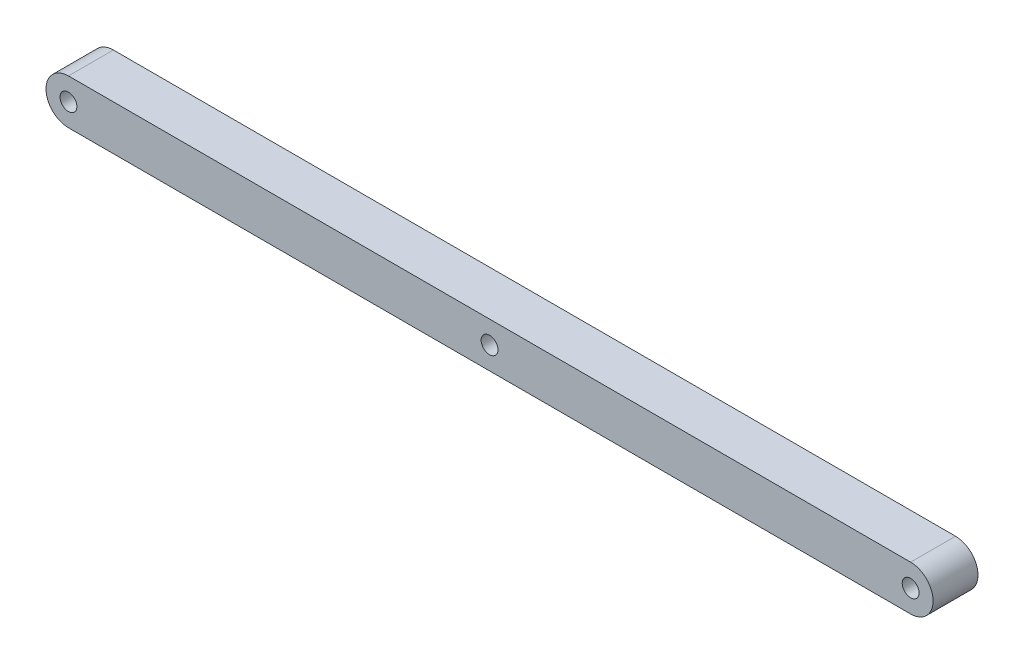
ISO-10303-21;
HEADER;
FILE_DESCRIPTION(('STEP AP214'),'2;1');
FILE_NAME('part.step','',(''),(''),'','','');
FILE_SCHEMA(('AUTOMOTIVE_DESIGN { 1 0 10303 214 1 1 1 1 }'));
ENDSEC;
DATA;
#1=APPLICATION_CONTEXT('core data for automotive mechanical design processes');
#2=APPLICATION_PROTOCOL_DEFINITION('international standard','automotive_design',2000,#1);
#3=PRODUCT_CONTEXT('',#1,'mechanical');
#4=PRODUCT('Part','Part','',(#3));
#5=PRODUCT_RELATED_PRODUCT_CATEGORY('part','',(#4));
#6=PRODUCT_DEFINITION_FORMATION('','',#4);
#7=PRODUCT_DEFINITION_CONTEXT('part definition',#1,'design');
#8=PRODUCT_DEFINITION('design','',#6,#7);
#9=PRODUCT_DEFINITION_SHAPE('','',#8);
#10=(LENGTH_UNIT() NAMED_UNIT(*) SI_UNIT(.MILLI.,.METRE.));
#11=(NAMED_UNIT(*) PLANE_ANGLE_UNIT() SI_UNIT($,.RADIAN.));
#12=(NAMED_UNIT(*) SI_UNIT($,.STERADIAN.) SOLID_ANGLE_UNIT());
#13=UNCERTAINTY_MEASURE_WITH_UNIT(LENGTH_MEASURE(1.E-05),#10,'distance_accuracy_value','');
#14=(GEOMETRIC_REPRESENTATION_CONTEXT(3) GLOBAL_UNCERTAINTY_ASSIGNED_CONTEXT((#13)) GLOBAL_UNIT_ASSIGNED_CONTEXT((#10,
#11,#12)) REPRESENTATION_CONTEXT('',''));
#15=CARTESIAN_POINT('',(0.,0.,0.));
#16=DIRECTION('',(0.,0.,1.));
#17=DIRECTION('',(1.,0.,0.));
#18=AXIS2_PLACEMENT_3D('',#15,#16,#17);
#19=CARTESIAN_POINT('',(75.,0.,8.));
#20=DIRECTION('',(0.,0.,1.));
#21=DIRECTION('',(1.,0.,0.));
#22=AXIS2_PLACEMENT_3D('',#19,#20,#21);
#23=PLANE('',#22);
#24=CARTESIAN_POINT('',(0.,0.,8.));
#25=DIRECTION('',(0.,0.,1.));
#26=DIRECTION('',(1.,0.,0.));
#27=AXIS2_PLACEMENT_3D('',#24,#25,#26);
#28=CIRCLE('',#27,1.5);
#29=CARTESIAN_POINT('',(1.5,0.,8.));
#30=VERTEX_POINT('',#29);
#31=EDGE_CURVE('E146',#30,#30,#28,.T.);
#32=ORIENTED_EDGE('',*,*,#31,.F.);
#33=EDGE_LOOP('',(#32));
#34=FACE_BOUND('',#33,.T.);
#35=CARTESIAN_POINT('',(-75.,0.,8.));
#36=DIRECTION('',(0.,0.,1.));
#37=DIRECTION('',(1.,0.,0.));
#38=AXIS2_PLACEMENT_3D('',#35,#36,#37);
#39=CIRCLE('',#38,1.5);
#40=CARTESIAN_POINT('',(-73.5,0.,8.));
#41=VERTEX_POINT('',#40);
#42=EDGE_CURVE('E113',#41,#41,#39,.T.);
#43=ORIENTED_EDGE('',*,*,#42,.F.);
#44=EDGE_LOOP('',(#43));
#45=FACE_BOUND('',#44,.T.);
#46=CARTESIAN_POINT('',(75.,0.,8.));
#47=DIRECTION('',(0.,0.,1.));
#48=DIRECTION('',(1.,0.,0.));
#49=AXIS2_PLACEMENT_3D('',#46,#47,#48);
#50=CIRCLE('',#49,4.);
#51=CARTESIAN_POINT('',(75.,-4.,8.));
#52=VERTEX_POINT('',#51);
#53=CARTESIAN_POINT('',(75.,4.,8.));
#54=VERTEX_POINT('',#53);
#55=EDGE_CURVE('E92',#52,#54,#50,.T.);
#56=ORIENTED_EDGE('',*,*,#55,.T.);
#57=DIRECTION('',(-1.,0.,0.));
#58=VECTOR('',#57,1.);
#59=CARTESIAN_POINT('',(75.,4.,8.));
#60=LINE('',#59,#58);
#61=CARTESIAN_POINT('',(-75.,3.99999999999998,8.));
#62=VERTEX_POINT('',#61);
#63=EDGE_CURVE('E87',#54,#62,#60,.T.);
#64=ORIENTED_EDGE('',*,*,#63,.T.);
#65=CARTESIAN_POINT('',(-75.,0.,8.));
#66=DIRECTION('',(0.,0.,1.));
#67=DIRECTION('',(1.,0.,0.));
#68=AXIS2_PLACEMENT_3D('',#65,#66,#67);
#69=CIRCLE('',#68,4.);
#70=CARTESIAN_POINT('',(-75.,-4.00000000000002,8.));
#71=VERTEX_POINT('',#70);
#72=EDGE_CURVE('E90',#62,#71,#69,.T.);
#73=ORIENTED_EDGE('',*,*,#72,.T.);
#74=DIRECTION('',(1.,0.,0.));
#75=VECTOR('',#74,1.);
#76=CARTESIAN_POINT('',(75.,-4.,8.));
#77=LINE('',#76,#75);
#78=EDGE_CURVE('E57',#71,#52,#77,.T.);
#79=ORIENTED_EDGE('',*,*,#78,.T.);
#80=EDGE_LOOP('',(#56,#64,#73,#79));
#81=FACE_BOUND('',#80,.T.);
#82=CARTESIAN_POINT('',(75.,0.,8.));
#83=DIRECTION('',(0.,0.,1.));
#84=DIRECTION('',(1.,0.,0.));
#85=AXIS2_PLACEMENT_3D('',#82,#83,#84);
#86=CIRCLE('',#85,1.5);
#87=CARTESIAN_POINT('',(76.5,0.,8.));
#88=VERTEX_POINT('',#87);
#89=EDGE_CURVE('E135',#88,#88,#86,.T.);
#90=ORIENTED_EDGE('',*,*,#89,.F.);
#91=EDGE_LOOP('',(#90));
#92=FACE_BOUND('',#91,.T.);
#93=ADVANCED_FACE('F38',(#34,#45,#81,#92),#23,.T.);
#94=CARTESIAN_POINT('',(75.,0.,0.));
#95=DIRECTION('',(0.,0.,1.));
#96=DIRECTION('',(1.,0.,0.));
#97=AXIS2_PLACEMENT_3D('',#94,#95,#96);
#98=PLANE('',#97);
#99=CARTESIAN_POINT('',(0.,0.,0.));
#100=DIRECTION('',(0.,0.,1.));
#101=DIRECTION('',(1.,0.,0.));
#102=AXIS2_PLACEMENT_3D('',#99,#100,#101);
#103=CIRCLE('',#102,1.5);
#104=CARTESIAN_POINT('',(1.5,0.,0.));
#105=VERTEX_POINT('',#104);
#106=EDGE_CURVE('E42',#105,#105,#103,.T.);
#107=ORIENTED_EDGE('',*,*,#106,.T.);
#108=EDGE_LOOP('',(#107));
#109=FACE_BOUND('',#108,.T.);
#110=CARTESIAN_POINT('',(75.,0.,0.));
#111=DIRECTION('',(0.,0.,1.));
#112=DIRECTION('',(1.,0.,0.));
#113=AXIS2_PLACEMENT_3D('',#110,#111,#112);
#114=CIRCLE('',#113,4.);
#115=CARTESIAN_POINT('',(75.,-4.,0.));
#116=VERTEX_POINT('',#115);
#117=CARTESIAN_POINT('',(75.,4.,0.));
#118=VERTEX_POINT('',#117);
#119=EDGE_CURVE('E109',#116,#118,#114,.T.);
#120=ORIENTED_EDGE('',*,*,#119,.F.);
#121=DIRECTION('',(1.,0.,0.));
#122=VECTOR('',#121,1.);
#123=CARTESIAN_POINT('',(75.,-4.,0.));
#124=LINE('',#123,#122);
#125=CARTESIAN_POINT('',(-75.,-4.00000000000002,0.));
#126=VERTEX_POINT('',#125);
#127=EDGE_CURVE('E80',#126,#116,#124,.T.);
#128=ORIENTED_EDGE('',*,*,#127,.F.);
#129=CARTESIAN_POINT('',(-75.,0.,0.));
#130=DIRECTION('',(0.,0.,1.));
#131=DIRECTION('',(1.,0.,0.));
#132=AXIS2_PLACEMENT_3D('',#129,#130,#131);
#133=CIRCLE('',#132,4.);
#134=CARTESIAN_POINT('',(-75.,3.99999999999998,0.));
#135=VERTEX_POINT('',#134);
#136=EDGE_CURVE('E74',#135,#126,#133,.T.);
#137=ORIENTED_EDGE('',*,*,#136,.F.);
#138=DIRECTION('',(-1.,0.,0.));
#139=VECTOR('',#138,1.);
#140=CARTESIAN_POINT('',(75.,4.,0.));
#141=LINE('',#140,#139);
#142=EDGE_CURVE('E97',#118,#135,#141,.T.);
#143=ORIENTED_EDGE('',*,*,#142,.F.);
#144=EDGE_LOOP('',(#120,#128,#137,#143));
#145=FACE_BOUND('',#144,.T.);
#146=CARTESIAN_POINT('',(-75.,0.,0.));
#147=DIRECTION('',(0.,0.,1.));
#148=DIRECTION('',(1.,0.,0.));
#149=AXIS2_PLACEMENT_3D('',#146,#147,#148);
#150=CIRCLE('',#149,1.5);
#151=CARTESIAN_POINT('',(-73.5,0.,0.));
#152=VERTEX_POINT('',#151);
#153=EDGE_CURVE('E131',#152,#152,#150,.T.);
#154=ORIENTED_EDGE('',*,*,#153,.T.);
#155=EDGE_LOOP('',(#154));
#156=FACE_BOUND('',#155,.T.);
#157=CARTESIAN_POINT('',(75.,0.,0.));
#158=DIRECTION('',(0.,0.,1.));
#159=DIRECTION('',(1.,0.,0.));
#160=AXIS2_PLACEMENT_3D('',#157,#158,#159);
#161=CIRCLE('',#160,1.5);
#162=CARTESIAN_POINT('',(76.5,0.,0.));
#163=VERTEX_POINT('',#162);
#164=EDGE_CURVE('E139',#163,#163,#161,.T.);
#165=ORIENTED_EDGE('',*,*,#164,.T.);
#166=EDGE_LOOP('',(#165));
#167=FACE_BOUND('',#166,.T.);
#168=ADVANCED_FACE('F126',(#109,#145,#156,#167),#98,.F.);
#169=CARTESIAN_POINT('',(75.,0.,8.));
#170=DIRECTION('',(0.,0.,-1.));
#171=DIRECTION('',(-1.,0.,0.));
#172=AXIS2_PLACEMENT_3D('',#169,#170,#171);
#173=CYLINDRICAL_SURFACE('',#172,4.);
#174=ORIENTED_EDGE('',*,*,#119,.T.);
#175=DIRECTION('',(0.,0.,-1.));
#176=VECTOR('',#175,1.);
#177=CARTESIAN_POINT('',(75.,4.,8.));
#178=LINE('',#177,#176);
#179=EDGE_CURVE('E11',#54,#118,#178,.T.);
#180=ORIENTED_EDGE('',*,*,#179,.F.);
#181=ORIENTED_EDGE('',*,*,#55,.F.);
#182=DIRECTION('',(0.,0.,-1.));
#183=VECTOR('',#182,1.);
#184=CARTESIAN_POINT('',(75.,-4.,8.));
#185=LINE('',#184,#183);
#186=EDGE_CURVE('E105',#52,#116,#185,.T.);
#187=ORIENTED_EDGE('',*,*,#186,.T.);
#188=EDGE_LOOP('',(#174,#180,#181,#187));
#189=FACE_BOUND('',#188,.T.);
#190=ADVANCED_FACE('F40',(#189),#173,.T.);
#191=CARTESIAN_POINT('',(75.,4.,8.));
#192=DIRECTION('',(0.,-1.,0.));
#193=DIRECTION('',(1.,0.,0.));
#194=AXIS2_PLACEMENT_3D('',#191,#192,#193);
#195=PLANE('',#194);
#196=ORIENTED_EDGE('',*,*,#142,.T.);
#197=DIRECTION('',(0.,0.,-1.));
#198=VECTOR('',#197,1.);
#199=CARTESIAN_POINT('',(-75.,3.99999999999998,8.));
#200=LINE('',#199,#198);
#201=EDGE_CURVE('E49',#62,#135,#200,.T.);
#202=ORIENTED_EDGE('',*,*,#201,.F.);
#203=ORIENTED_EDGE('',*,*,#63,.F.);
#204=ORIENTED_EDGE('',*,*,#179,.T.);
#205=EDGE_LOOP('',(#196,#202,#203,#204));
#206=FACE_BOUND('',#205,.T.);
#207=ADVANCED_FACE('F96',(#206),#195,.F.);
#208=CARTESIAN_POINT('',(-75.,0.,8.));
#209=DIRECTION('',(0.,0.,-1.));
#210=DIRECTION('',(-1.,0.,0.));
#211=AXIS2_PLACEMENT_3D('',#208,#209,#210);
#212=CYLINDRICAL_SURFACE('',#211,4.);
#213=ORIENTED_EDGE('',*,*,#136,.T.);
#214=DIRECTION('',(0.,0.,-1.));
#215=VECTOR('',#214,1.);
#216=CARTESIAN_POINT('',(-75.,-4.00000000000002,8.));
#217=LINE('',#216,#215);
#218=EDGE_CURVE('E99',#71,#126,#217,.T.);
#219=ORIENTED_EDGE('',*,*,#218,.F.);
#220=ORIENTED_EDGE('',*,*,#72,.F.);
#221=ORIENTED_EDGE('',*,*,#201,.T.);
#222=EDGE_LOOP('',(#213,#219,#220,#221));
#223=FACE_BOUND('',#222,.T.);
#224=ADVANCED_FACE('F101',(#223),#212,.T.);
#225=CARTESIAN_POINT('',(75.,-4.,8.));
#226=DIRECTION('',(0.,1.,0.));
#227=DIRECTION('',(-1.,0.,0.));
#228=AXIS2_PLACEMENT_3D('',#225,#226,#227);
#229=PLANE('',#228);
#230=ORIENTED_EDGE('',*,*,#127,.T.);
#231=ORIENTED_EDGE('',*,*,#186,.F.);
#232=ORIENTED_EDGE('',*,*,#78,.F.);
#233=ORIENTED_EDGE('',*,*,#218,.T.);
#234=EDGE_LOOP('',(#230,#231,#232,#233));
#235=FACE_BOUND('',#234,.T.);
#236=ADVANCED_FACE('F123',(#235),#229,.F.);
#237=CARTESIAN_POINT('',(-75.,0.,8.));
#238=DIRECTION('',(0.,0.,-1.));
#239=DIRECTION('',(-1.,0.,0.));
#240=AXIS2_PLACEMENT_3D('',#237,#238,#239);
#241=CYLINDRICAL_SURFACE('',#240,1.5);
#242=ORIENTED_EDGE('',*,*,#42,.T.);
#243=EDGE_LOOP('',(#242));
#244=FACE_BOUND('',#243,.T.);
#245=ORIENTED_EDGE('',*,*,#153,.F.);
#246=EDGE_LOOP('',(#245));
#247=FACE_BOUND('',#246,.T.);
#248=ADVANCED_FACE('F163',(#244,#247),#241,.F.);
#249=CARTESIAN_POINT('',(75.,0.,8.));
#250=DIRECTION('',(0.,0.,-1.));
#251=DIRECTION('',(-1.,0.,0.));
#252=AXIS2_PLACEMENT_3D('',#249,#250,#251);
#253=CYLINDRICAL_SURFACE('',#252,1.5);
#254=ORIENTED_EDGE('',*,*,#89,.T.);
#255=EDGE_LOOP('',(#254));
#256=FACE_BOUND('',#255,.T.);
#257=ORIENTED_EDGE('',*,*,#164,.F.);
#258=EDGE_LOOP('',(#257));
#259=FACE_BOUND('',#258,.T.);
#260=ADVANCED_FACE('F158',(#256,#259),#253,.F.);
#261=CARTESIAN_POINT('',(0.,0.,-2.));
#262=DIRECTION('',(0.,0.,1.));
#263=DIRECTION('',(1.,0.,0.));
#264=AXIS2_PLACEMENT_3D('',#261,#262,#263);
#265=CYLINDRICAL_SURFACE('',#264,1.5);
#266=ORIENTED_EDGE('',*,*,#31,.T.);
#267=EDGE_LOOP('',(#266));
#268=FACE_BOUND('',#267,.T.);
#269=ORIENTED_EDGE('',*,*,#106,.F.);
#270=EDGE_LOOP('',(#269));
#271=FACE_BOUND('',#270,.T.);
#272=ADVANCED_FACE('F156',(#268,#271),#265,.F.);
#273=CLOSED_SHELL('',(#93,#168,#190,#207,#224,#236,#248,#260,#272));
#274=MANIFOLD_SOLID_BREP('B2',#273);
#275=ADVANCED_BREP_SHAPE_REPRESENTATION('',(#18,#274),#14);
#276=SHAPE_DEFINITION_REPRESENTATION(#9,#275);
ENDSEC;
END-ISO-10303-21;
